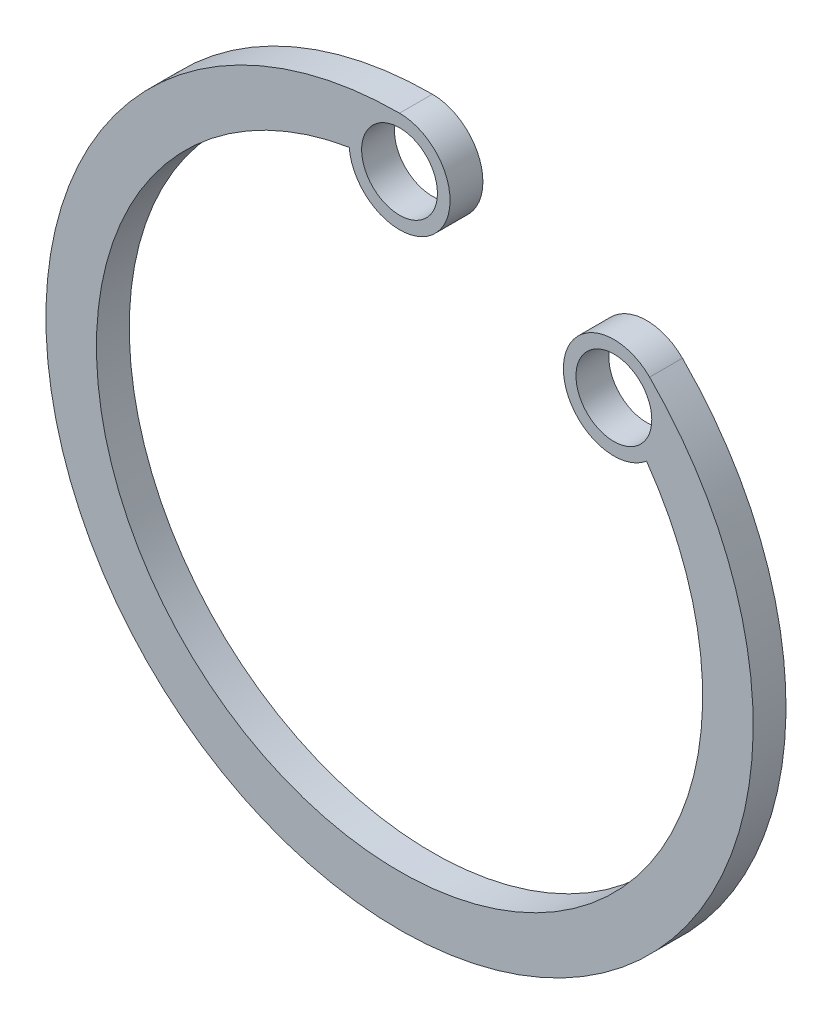
ISO-10303-21;
HEADER;
FILE_DESCRIPTION(('STEP AP214'),'2;1');
FILE_NAME('part.step','',(''),(''),'','','');
FILE_SCHEMA(('AUTOMOTIVE_DESIGN { 1 0 10303 214 1 1 1 1 }'));
ENDSEC;
DATA;
#1=APPLICATION_CONTEXT('core data for automotive mechanical design processes');
#2=APPLICATION_PROTOCOL_DEFINITION('international standard','automotive_design',2000,#1);
#3=PRODUCT_CONTEXT('',#1,'mechanical');
#4=PRODUCT('Part','Part','',(#3));
#5=PRODUCT_RELATED_PRODUCT_CATEGORY('part','',(#4));
#6=PRODUCT_DEFINITION_FORMATION('','',#4);
#7=PRODUCT_DEFINITION_CONTEXT('part definition',#1,'design');
#8=PRODUCT_DEFINITION('design','',#6,#7);
#9=PRODUCT_DEFINITION_SHAPE('','',#8);
#10=(LENGTH_UNIT() NAMED_UNIT(*) SI_UNIT(.MILLI.,.METRE.));
#11=(NAMED_UNIT(*) PLANE_ANGLE_UNIT() SI_UNIT($,.RADIAN.));
#12=(NAMED_UNIT(*) SI_UNIT($,.STERADIAN.) SOLID_ANGLE_UNIT());
#13=UNCERTAINTY_MEASURE_WITH_UNIT(LENGTH_MEASURE(1.E-05),#10,'distance_accuracy_value','');
#14=(GEOMETRIC_REPRESENTATION_CONTEXT(3) GLOBAL_UNCERTAINTY_ASSIGNED_CONTEXT((#13)) GLOBAL_UNIT_ASSIGNED_CONTEXT((#10,
#11,#12)) REPRESENTATION_CONTEXT('',''));
#15=CARTESIAN_POINT('',(0.,0.,0.));
#16=DIRECTION('',(0.,0.,1.));
#17=DIRECTION('',(1.,0.,0.));
#18=AXIS2_PLACEMENT_3D('',#15,#16,#17);
#19=CARTESIAN_POINT('',(8.48528137423942,8.48528137423889,1.3));
#20=DIRECTION('',(0.,0.,-1.));
#21=DIRECTION('',(-1.,0.,0.));
#22=AXIS2_PLACEMENT_3D('',#19,#20,#21);
#23=CYLINDRICAL_SURFACE('',#22,1.99999999999942);
#24=CARTESIAN_POINT('',(8.48528137423942,8.48528137423889,0.));
#25=DIRECTION('',(0.,0.,1.));
#26=DIRECTION('',(1.,0.,0.));
#27=AXIS2_PLACEMENT_3D('',#24,#25,#26);
#28=CIRCLE('',#27,1.99999999999942);
#29=CARTESIAN_POINT('',(9.89949493661206,9.89949493661144,0.));
#30=VERTEX_POINT('',#29);
#31=CARTESIAN_POINT('',(9.77672478781463,6.95813570026706,0.));
#32=VERTEX_POINT('',#31);
#33=EDGE_CURVE('E124',#30,#32,#28,.T.);
#34=ORIENTED_EDGE('',*,*,#33,.T.);
#35=DIRECTION('',(0.,0.,-1.));
#36=VECTOR('',#35,1.);
#37=CARTESIAN_POINT('',(9.77672478781463,6.95813570026706,1.3));
#38=LINE('',#37,#36);
#39=CARTESIAN_POINT('',(9.77672478781463,6.95813570026706,1.3));
#40=VERTEX_POINT('',#39);
#41=EDGE_CURVE('E11',#40,#32,#38,.T.);
#42=ORIENTED_EDGE('',*,*,#41,.F.);
#43=CARTESIAN_POINT('',(8.48528137423942,8.48528137423889,1.3));
#44=DIRECTION('',(0.,0.,1.));
#45=DIRECTION('',(1.,0.,0.));
#46=AXIS2_PLACEMENT_3D('',#43,#44,#45);
#47=CIRCLE('',#46,1.99999999999942);
#48=CARTESIAN_POINT('',(9.89949493661206,9.89949493661144,1.3));
#49=VERTEX_POINT('',#48);
#50=EDGE_CURVE('E88',#49,#40,#47,.T.);
#51=ORIENTED_EDGE('',*,*,#50,.F.);
#52=DIRECTION('',(0.,0.,-1.));
#53=VECTOR('',#52,1.);
#54=CARTESIAN_POINT('',(9.89949493661206,9.89949493661144,1.3));
#55=LINE('',#54,#53);
#56=EDGE_CURVE('E123',#49,#30,#55,.T.);
#57=ORIENTED_EDGE('',*,*,#56,.T.);
#58=EDGE_LOOP('',(#34,#42,#51,#57));
#59=FACE_BOUND('',#58,.T.);
#60=ADVANCED_FACE('F45',(#59),#23,.T.);
#61=CARTESIAN_POINT('',(0.,0.,1.3));
#62=DIRECTION('',(0.,0.,-1.));
#63=DIRECTION('',(-1.,0.,0.));
#64=AXIS2_PLACEMENT_3D('',#61,#62,#63);
#65=CYLINDRICAL_SURFACE('',#64,12.);
#66=CARTESIAN_POINT('',(0.,0.,0.));
#67=DIRECTION('',(0.,0.,1.));
#68=DIRECTION('',(1.,0.,0.));
#69=AXIS2_PLACEMENT_3D('',#66,#67,#68);
#70=CIRCLE('',#69,12.);
#71=CARTESIAN_POINT('',(-1.99304345718356,11.8333333333333,0.));
#72=VERTEX_POINT('',#71);
#73=EDGE_CURVE('E98',#72,#32,#70,.T.);
#74=ORIENTED_EDGE('',*,*,#73,.F.);
#75=DIRECTION('',(0.,0.,-1.));
#76=VECTOR('',#75,1.);
#77=CARTESIAN_POINT('',(-1.99304345718356,11.8333333333333,1.3));
#78=LINE('',#77,#76);
#79=CARTESIAN_POINT('',(-1.99304345718356,11.8333333333333,1.3));
#80=VERTEX_POINT('',#79);
#81=EDGE_CURVE('E54',#80,#72,#78,.T.);
#82=ORIENTED_EDGE('',*,*,#81,.F.);
#83=CARTESIAN_POINT('',(0.,0.,1.3));
#84=DIRECTION('',(0.,0.,1.));
#85=DIRECTION('',(1.,0.,0.));
#86=AXIS2_PLACEMENT_3D('',#83,#84,#85);
#87=CIRCLE('',#86,12.);
#88=EDGE_CURVE('E96',#80,#40,#87,.T.);
#89=ORIENTED_EDGE('',*,*,#88,.T.);
#90=ORIENTED_EDGE('',*,*,#41,.T.);
#91=EDGE_LOOP('',(#74,#82,#89,#90));
#92=FACE_BOUND('',#91,.T.);
#93=ADVANCED_FACE('F95',(#92),#65,.F.);
#94=CARTESIAN_POINT('',(0.,12.,1.3));
#95=DIRECTION('',(0.,0.,-1.));
#96=DIRECTION('',(-1.,0.,0.));
#97=AXIS2_PLACEMENT_3D('',#94,#95,#96);
#98=CYLINDRICAL_SURFACE('',#97,2.);
#99=CARTESIAN_POINT('',(0.,12.,0.));
#100=DIRECTION('',(0.,0.,1.));
#101=DIRECTION('',(1.,0.,0.));
#102=AXIS2_PLACEMENT_3D('',#99,#100,#101);
#103=CIRCLE('',#102,2.);
#104=CARTESIAN_POINT('',(0.,14.,0.));
#105=VERTEX_POINT('',#104);
#106=EDGE_CURVE('E77',#72,#105,#103,.T.);
#107=ORIENTED_EDGE('',*,*,#106,.T.);
#108=DIRECTION('',(0.,0.,-1.));
#109=VECTOR('',#108,1.);
#110=CARTESIAN_POINT('',(0.,14.,1.3));
#111=LINE('',#110,#109);
#112=CARTESIAN_POINT('',(0.,14.,1.3));
#113=VERTEX_POINT('',#112);
#114=EDGE_CURVE('E100',#113,#105,#111,.T.);
#115=ORIENTED_EDGE('',*,*,#114,.F.);
#116=CARTESIAN_POINT('',(0.,12.,1.3));
#117=DIRECTION('',(0.,0.,1.));
#118=DIRECTION('',(1.,0.,0.));
#119=AXIS2_PLACEMENT_3D('',#116,#117,#118);
#120=CIRCLE('',#119,2.);
#121=EDGE_CURVE('E101',#80,#113,#120,.T.);
#122=ORIENTED_EDGE('',*,*,#121,.F.);
#123=ORIENTED_EDGE('',*,*,#81,.T.);
#124=EDGE_LOOP('',(#107,#115,#122,#123));
#125=FACE_BOUND('',#124,.T.);
#126=ADVANCED_FACE('F102',(#125),#98,.T.);
#127=CARTESIAN_POINT('',(0.,12.,1.3));
#128=DIRECTION('',(0.,0.,-1.));
#129=DIRECTION('',(-1.,0.,0.));
#130=AXIS2_PLACEMENT_3D('',#127,#128,#129);
#131=CYLINDRICAL_SURFACE('',#130,1.5);
#132=CARTESIAN_POINT('',(0.,12.,1.3));
#133=DIRECTION('',(0.,0.,1.));
#134=DIRECTION('',(1.,0.,0.));
#135=AXIS2_PLACEMENT_3D('',#132,#133,#134);
#136=CIRCLE('',#135,1.5);
#137=CARTESIAN_POINT('',(1.5,12.,1.3));
#138=VERTEX_POINT('',#137);
#139=EDGE_CURVE('E115',#138,#138,#136,.T.);
#140=ORIENTED_EDGE('',*,*,#139,.T.);
#141=EDGE_LOOP('',(#140));
#142=FACE_BOUND('',#141,.T.);
#143=CARTESIAN_POINT('',(0.,12.,0.));
#144=DIRECTION('',(0.,0.,1.));
#145=DIRECTION('',(1.,0.,0.));
#146=AXIS2_PLACEMENT_3D('',#143,#144,#145);
#147=CIRCLE('',#146,1.5);
#148=CARTESIAN_POINT('',(1.5,12.,0.));
#149=VERTEX_POINT('',#148);
#150=EDGE_CURVE('E134',#149,#149,#147,.T.);
#151=ORIENTED_EDGE('',*,*,#150,.F.);
#152=EDGE_LOOP('',(#151));
#153=FACE_BOUND('',#152,.T.);
#154=ADVANCED_FACE('F157',(#142,#153),#131,.F.);
#155=CARTESIAN_POINT('',(0.,0.,1.3));
#156=DIRECTION('',(0.,0.,-1.));
#157=DIRECTION('',(-1.,0.,0.));
#158=AXIS2_PLACEMENT_3D('',#155,#156,#157);
#159=CYLINDRICAL_SURFACE('',#158,14.);
#160=CARTESIAN_POINT('',(0.,0.,0.));
#161=DIRECTION('',(0.,0.,1.));
#162=DIRECTION('',(1.,0.,0.));
#163=AXIS2_PLACEMENT_3D('',#160,#161,#162);
#164=CIRCLE('',#163,14.);
#165=EDGE_CURVE('E83',#105,#30,#164,.T.);
#166=ORIENTED_EDGE('',*,*,#165,.T.);
#167=ORIENTED_EDGE('',*,*,#56,.F.);
#168=CARTESIAN_POINT('',(0.,0.,1.3));
#169=DIRECTION('',(0.,0.,1.));
#170=DIRECTION('',(1.,0.,0.));
#171=AXIS2_PLACEMENT_3D('',#168,#169,#170);
#172=CIRCLE('',#171,14.);
#173=EDGE_CURVE('E62',#113,#49,#172,.T.);
#174=ORIENTED_EDGE('',*,*,#173,.F.);
#175=ORIENTED_EDGE('',*,*,#114,.T.);
#176=EDGE_LOOP('',(#166,#167,#174,#175));
#177=FACE_BOUND('',#176,.T.);
#178=ADVANCED_FACE('F144',(#177),#159,.T.);
#179=CARTESIAN_POINT('',(8.48528137423942,8.48528137423889,1.3));
#180=DIRECTION('',(0.,0.,-1.));
#181=DIRECTION('',(-1.,0.,0.));
#182=AXIS2_PLACEMENT_3D('',#179,#180,#181);
#183=CYLINDRICAL_SURFACE('',#182,1.49999999999942);
#184=CARTESIAN_POINT('',(8.48528137423942,8.48528137423889,1.3));
#185=DIRECTION('',(0.,0.,1.));
#186=DIRECTION('',(1.,0.,0.));
#187=AXIS2_PLACEMENT_3D('',#184,#185,#186);
#188=CIRCLE('',#187,1.49999999999942);
#189=CARTESIAN_POINT('',(9.98528137423884,8.48528137423889,1.3));
#190=VERTEX_POINT('',#189);
#191=EDGE_CURVE('E119',#190,#190,#188,.T.);
#192=ORIENTED_EDGE('',*,*,#191,.T.);
#193=EDGE_LOOP('',(#192));
#194=FACE_BOUND('',#193,.T.);
#195=CARTESIAN_POINT('',(8.48528137423942,8.48528137423889,0.));
#196=DIRECTION('',(0.,0.,1.));
#197=DIRECTION('',(1.,0.,0.));
#198=AXIS2_PLACEMENT_3D('',#195,#196,#197);
#199=CIRCLE('',#198,1.49999999999942);
#200=CARTESIAN_POINT('',(9.98528137423884,8.48528137423889,0.));
#201=VERTEX_POINT('',#200);
#202=EDGE_CURVE('E110',#201,#201,#199,.T.);
#203=ORIENTED_EDGE('',*,*,#202,.F.);
#204=EDGE_LOOP('',(#203));
#205=FACE_BOUND('',#204,.T.);
#206=ADVANCED_FACE('F162',(#194,#205),#183,.F.);
#207=CARTESIAN_POINT('',(0.,0.,1.3));
#208=DIRECTION('',(0.,0.,1.));
#209=DIRECTION('',(1.,0.,0.));
#210=AXIS2_PLACEMENT_3D('',#207,#208,#209);
#211=PLANE('',#210);
#212=ORIENTED_EDGE('',*,*,#50,.T.);
#213=ORIENTED_EDGE('',*,*,#88,.F.);
#214=ORIENTED_EDGE('',*,*,#121,.T.);
#215=ORIENTED_EDGE('',*,*,#173,.T.);
#216=EDGE_LOOP('',(#212,#213,#214,#215));
#217=FACE_BOUND('',#216,.T.);
#218=ORIENTED_EDGE('',*,*,#139,.F.);
#219=EDGE_LOOP('',(#218));
#220=FACE_BOUND('',#219,.T.);
#221=ORIENTED_EDGE('',*,*,#191,.F.);
#222=EDGE_LOOP('',(#221));
#223=FACE_BOUND('',#222,.T.);
#224=ADVANCED_FACE('F105',(#217,#220,#223),#211,.T.);
#225=CARTESIAN_POINT('',(0.,0.,0.));
#226=DIRECTION('',(0.,0.,1.));
#227=DIRECTION('',(1.,0.,0.));
#228=AXIS2_PLACEMENT_3D('',#225,#226,#227);
#229=PLANE('',#228);
#230=ORIENTED_EDGE('',*,*,#33,.F.);
#231=ORIENTED_EDGE('',*,*,#165,.F.);
#232=ORIENTED_EDGE('',*,*,#106,.F.);
#233=ORIENTED_EDGE('',*,*,#73,.T.);
#234=EDGE_LOOP('',(#230,#231,#232,#233));
#235=FACE_BOUND('',#234,.T.);
#236=ORIENTED_EDGE('',*,*,#150,.T.);
#237=EDGE_LOOP('',(#236));
#238=FACE_BOUND('',#237,.T.);
#239=ORIENTED_EDGE('',*,*,#202,.T.);
#240=EDGE_LOOP('',(#239));
#241=FACE_BOUND('',#240,.T.);
#242=ADVANCED_FACE('F147',(#235,#238,#241),#229,.F.);
#243=CLOSED_SHELL('',(#60,#93,#126,#154,#178,#206,#224,#242));
#244=MANIFOLD_SOLID_BREP('B2',#243);
#245=ADVANCED_BREP_SHAPE_REPRESENTATION('',(#18,#244),#14);
#246=SHAPE_DEFINITION_REPRESENTATION(#9,#245);
ENDSEC;
END-ISO-10303-21;
